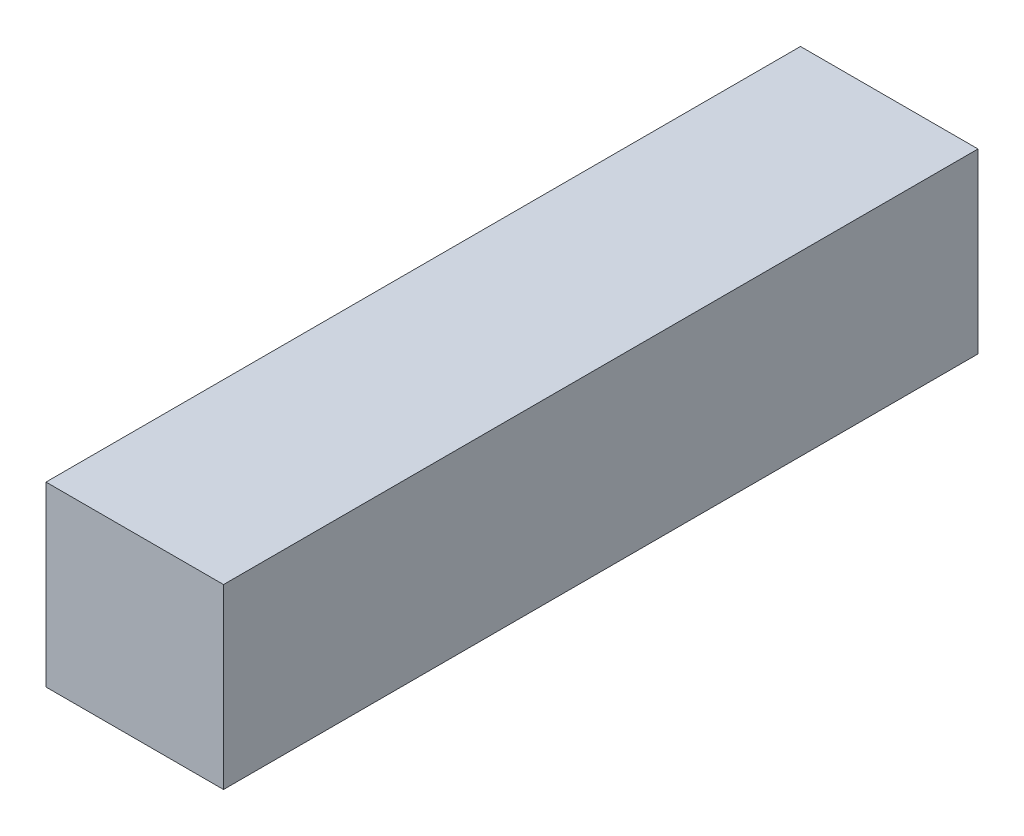
ISO-10303-21;
HEADER;
FILE_DESCRIPTION(('STEP AP214'),'2;1');
FILE_NAME('part.step','',(''),(''),'','','');
FILE_SCHEMA(('AUTOMOTIVE_DESIGN { 1 0 10303 214 1 1 1 1 }'));
ENDSEC;
DATA;
#1=APPLICATION_CONTEXT('core data for automotive mechanical design processes');
#2=APPLICATION_PROTOCOL_DEFINITION('international standard','automotive_design',2000,#1);
#3=PRODUCT_CONTEXT('',#1,'mechanical');
#4=PRODUCT('Part','Part','',(#3));
#5=PRODUCT_RELATED_PRODUCT_CATEGORY('part','',(#4));
#6=PRODUCT_DEFINITION_FORMATION('','',#4);
#7=PRODUCT_DEFINITION_CONTEXT('part definition',#1,'design');
#8=PRODUCT_DEFINITION('design','',#6,#7);
#9=PRODUCT_DEFINITION_SHAPE('','',#8);
#10=(LENGTH_UNIT() NAMED_UNIT(*) SI_UNIT(.MILLI.,.METRE.));
#11=(NAMED_UNIT(*) PLANE_ANGLE_UNIT() SI_UNIT($,.RADIAN.));
#12=(NAMED_UNIT(*) SI_UNIT($,.STERADIAN.) SOLID_ANGLE_UNIT());
#13=UNCERTAINTY_MEASURE_WITH_UNIT(LENGTH_MEASURE(1.E-05),#10,'distance_accuracy_value','');
#14=(GEOMETRIC_REPRESENTATION_CONTEXT(3) GLOBAL_UNCERTAINTY_ASSIGNED_CONTEXT((#13)) GLOBAL_UNIT_ASSIGNED_CONTEXT((#10,
#11,#12)) REPRESENTATION_CONTEXT('',''));
#15=CARTESIAN_POINT('',(0.,0.,0.));
#16=DIRECTION('',(0.,0.,1.));
#17=DIRECTION('',(1.,0.,0.));
#18=AXIS2_PLACEMENT_3D('',#15,#16,#17);
#19=CARTESIAN_POINT('',(-3.175,-3.175,13.49375));
#20=DIRECTION('',(1.,0.,0.));
#21=DIRECTION('',(0.,0.,-1.));
#22=AXIS2_PLACEMENT_3D('',#19,#20,#21);
#23=PLANE('',#22);
#24=DIRECTION('',(0.,0.,1.));
#25=VECTOR('',#24,1.);
#26=CARTESIAN_POINT('',(-3.175,-3.175,13.49375));
#27=LINE('',#26,#25);
#28=CARTESIAN_POINT('',(-3.175,-3.175,-13.49375));
#29=VERTEX_POINT('',#28);
#30=CARTESIAN_POINT('',(-3.175,-3.175,13.49375));
#31=VERTEX_POINT('',#30);
#32=EDGE_CURVE('E20',#29,#31,#27,.T.);
#33=ORIENTED_EDGE('',*,*,#32,.T.);
#34=DIRECTION('',(0.,1.,0.));
#35=VECTOR('',#34,1.);
#36=CARTESIAN_POINT('',(-3.175,0.,13.49375));
#37=LINE('',#36,#35);
#38=CARTESIAN_POINT('',(-3.175,3.175,13.49375));
#39=VERTEX_POINT('',#38);
#40=EDGE_CURVE('E64',#31,#39,#37,.T.);
#41=ORIENTED_EDGE('',*,*,#40,.T.);
#42=DIRECTION('',(0.,0.,-1.));
#43=VECTOR('',#42,1.);
#44=CARTESIAN_POINT('',(-3.175,3.175,13.49375));
#45=LINE('',#44,#43);
#46=CARTESIAN_POINT('',(-3.175,3.175,-13.49375));
#47=VERTEX_POINT('',#46);
#48=EDGE_CURVE('E93',#39,#47,#45,.T.);
#49=ORIENTED_EDGE('',*,*,#48,.T.);
#50=DIRECTION('',(0.,1.,0.));
#51=VECTOR('',#50,1.);
#52=CARTESIAN_POINT('',(-3.175,0.,-13.49375));
#53=LINE('',#52,#51);
#54=EDGE_CURVE('E68',#29,#47,#53,.T.);
#55=ORIENTED_EDGE('',*,*,#54,.F.);
#56=EDGE_LOOP('',(#33,#41,#49,#55));
#57=FACE_BOUND('',#56,.T.);
#58=ADVANCED_FACE('F17',(#57),#23,.F.);
#59=CARTESIAN_POINT('',(-3.175,-3.175,13.49375));
#60=DIRECTION('',(0.,1.,0.));
#61=DIRECTION('',(0.,0.,1.));
#62=AXIS2_PLACEMENT_3D('',#59,#60,#61);
#63=PLANE('',#62);
#64=DIRECTION('',(0.,0.,1.));
#65=VECTOR('',#64,1.);
#66=CARTESIAN_POINT('',(3.175,-3.175,13.49375));
#67=LINE('',#66,#65);
#68=CARTESIAN_POINT('',(3.175,-3.175,-13.49375));
#69=VERTEX_POINT('',#68);
#70=CARTESIAN_POINT('',(3.175,-3.175,13.49375));
#71=VERTEX_POINT('',#70);
#72=EDGE_CURVE('E85',#69,#71,#67,.T.);
#73=ORIENTED_EDGE('',*,*,#72,.T.);
#74=DIRECTION('',(-1.,0.,0.));
#75=VECTOR('',#74,1.);
#76=CARTESIAN_POINT('',(0.,-3.175,13.49375));
#77=LINE('',#76,#75);
#78=EDGE_CURVE('E74',#71,#31,#77,.T.);
#79=ORIENTED_EDGE('',*,*,#78,.T.);
#80=ORIENTED_EDGE('',*,*,#32,.F.);
#81=DIRECTION('',(-1.,0.,0.));
#82=VECTOR('',#81,1.);
#83=CARTESIAN_POINT('',(0.,-3.175,-13.49375));
#84=LINE('',#83,#82);
#85=EDGE_CURVE('E96',#69,#29,#84,.T.);
#86=ORIENTED_EDGE('',*,*,#85,.F.);
#87=EDGE_LOOP('',(#73,#79,#80,#86));
#88=FACE_BOUND('',#87,.T.);
#89=ADVANCED_FACE('F84',(#88),#63,.F.);
#90=CARTESIAN_POINT('',(0.,0.,13.49375));
#91=DIRECTION('',(0.,0.,-1.));
#92=DIRECTION('',(-1.,0.,0.));
#93=AXIS2_PLACEMENT_3D('',#90,#91,#92);
#94=PLANE('',#93);
#95=DIRECTION('',(1.,0.,0.));
#96=VECTOR('',#95,1.);
#97=CARTESIAN_POINT('',(-3.175,3.175,13.49375));
#98=LINE('',#97,#96);
#99=CARTESIAN_POINT('',(3.175,3.175,13.49375));
#100=VERTEX_POINT('',#99);
#101=EDGE_CURVE('E80',#100,#39,#98,.F.);
#102=ORIENTED_EDGE('',*,*,#101,.T.);
#103=ORIENTED_EDGE('',*,*,#40,.F.);
#104=ORIENTED_EDGE('',*,*,#78,.F.);
#105=DIRECTION('',(0.,1.,0.));
#106=VECTOR('',#105,1.);
#107=CARTESIAN_POINT('',(3.175,-3.175,13.49375));
#108=LINE('',#107,#106);
#109=EDGE_CURVE('E104',#71,#100,#108,.T.);
#110=ORIENTED_EDGE('',*,*,#109,.T.);
#111=EDGE_LOOP('',(#102,#103,#104,#110));
#112=FACE_BOUND('',#111,.T.);
#113=ADVANCED_FACE('F77',(#112),#94,.F.);
#114=CARTESIAN_POINT('',(-3.175,3.175,13.49375));
#115=DIRECTION('',(0.,-1.,0.));
#116=DIRECTION('',(0.,0.,-1.));
#117=AXIS2_PLACEMENT_3D('',#114,#115,#116);
#118=PLANE('',#117);
#119=ORIENTED_EDGE('',*,*,#48,.F.);
#120=ORIENTED_EDGE('',*,*,#101,.F.);
#121=DIRECTION('',(0.,0.,1.));
#122=VECTOR('',#121,1.);
#123=CARTESIAN_POINT('',(3.175,3.175,13.49375));
#124=LINE('',#123,#122);
#125=CARTESIAN_POINT('',(3.175,3.175,-13.49375));
#126=VERTEX_POINT('',#125);
#127=EDGE_CURVE('E27',#100,#126,#124,.F.);
#128=ORIENTED_EDGE('',*,*,#127,.T.);
#129=DIRECTION('',(-1.,0.,0.));
#130=VECTOR('',#129,1.);
#131=CARTESIAN_POINT('',(0.,3.175,-13.49375));
#132=LINE('',#131,#130);
#133=EDGE_CURVE('E39',#47,#126,#132,.F.);
#134=ORIENTED_EDGE('',*,*,#133,.F.);
#135=EDGE_LOOP('',(#119,#120,#128,#134));
#136=FACE_BOUND('',#135,.T.);
#137=ADVANCED_FACE('F112',(#136),#118,.F.);
#138=CARTESIAN_POINT('',(0.,0.,-13.49375));
#139=DIRECTION('',(0.,0.,-1.));
#140=DIRECTION('',(-1.,0.,0.));
#141=AXIS2_PLACEMENT_3D('',#138,#139,#140);
#142=PLANE('',#141);
#143=ORIENTED_EDGE('',*,*,#54,.T.);
#144=ORIENTED_EDGE('',*,*,#133,.T.);
#145=DIRECTION('',(0.,1.,0.));
#146=VECTOR('',#145,1.);
#147=CARTESIAN_POINT('',(3.175,-3.175,-13.49375));
#148=LINE('',#147,#146);
#149=EDGE_CURVE('E11',#126,#69,#148,.F.);
#150=ORIENTED_EDGE('',*,*,#149,.T.);
#151=ORIENTED_EDGE('',*,*,#85,.T.);
#152=EDGE_LOOP('',(#143,#144,#150,#151));
#153=FACE_BOUND('',#152,.T.);
#154=ADVANCED_FACE('F115',(#153),#142,.T.);
#155=CARTESIAN_POINT('',(3.175,-3.175,13.49375));
#156=DIRECTION('',(-1.,0.,0.));
#157=DIRECTION('',(0.,0.,1.));
#158=AXIS2_PLACEMENT_3D('',#155,#156,#157);
#159=PLANE('',#158);
#160=ORIENTED_EDGE('',*,*,#127,.F.);
#161=ORIENTED_EDGE('',*,*,#109,.F.);
#162=ORIENTED_EDGE('',*,*,#72,.F.);
#163=ORIENTED_EDGE('',*,*,#149,.F.);
#164=EDGE_LOOP('',(#160,#161,#162,#163));
#165=FACE_BOUND('',#164,.T.);
#166=ADVANCED_FACE('F114',(#165),#159,.F.);
#167=CLOSED_SHELL('',(#58,#89,#113,#137,#154,#166));
#168=MANIFOLD_SOLID_BREP('B1',#167);
#169=ADVANCED_BREP_SHAPE_REPRESENTATION('',(#18,#168),#14);
#170=SHAPE_DEFINITION_REPRESENTATION(#9,#169);
ENDSEC;
END-ISO-10303-21;
